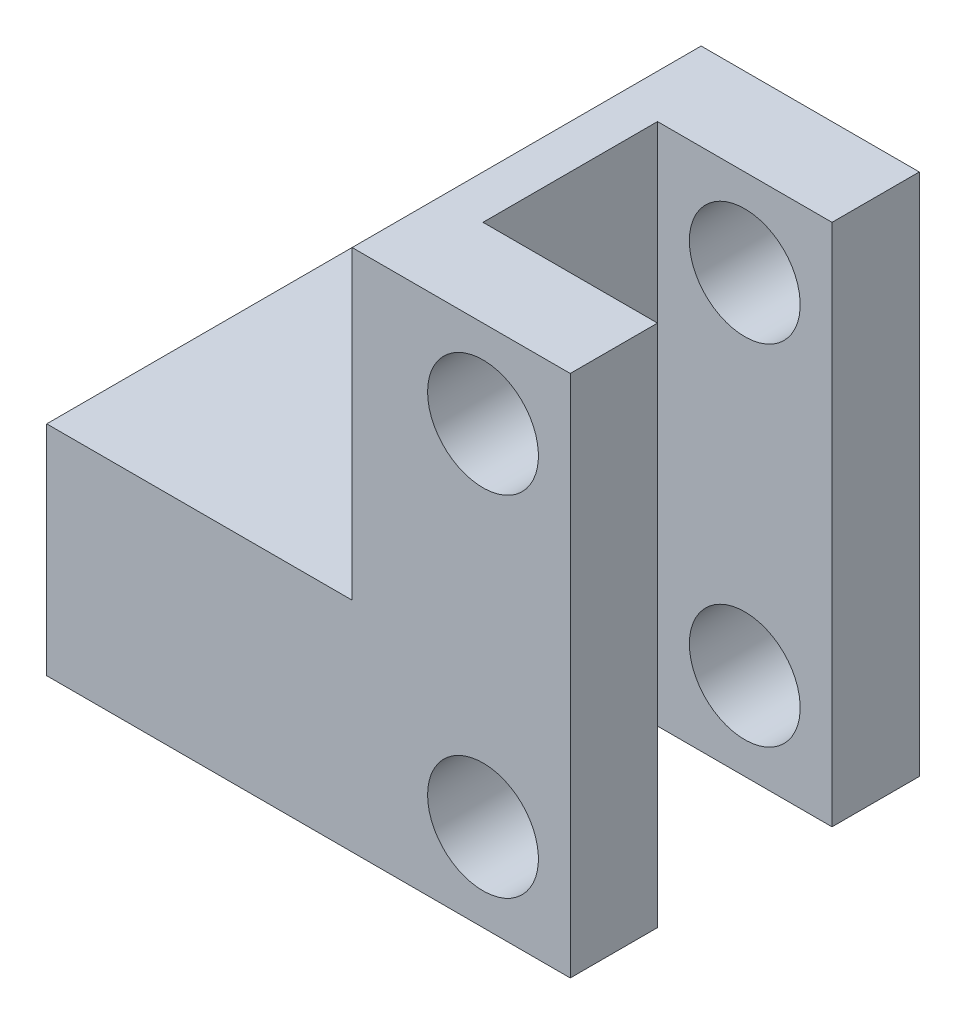
ISO-10303-21;
HEADER;
FILE_DESCRIPTION(('STEP AP214'),'2;1');
FILE_NAME('part.step','',(''),(''),'','','');
FILE_SCHEMA(('AUTOMOTIVE_DESIGN { 1 0 10303 214 1 1 1 1 }'));
ENDSEC;
DATA;
#1=APPLICATION_CONTEXT('core data for automotive mechanical design processes');
#2=APPLICATION_PROTOCOL_DEFINITION('international standard','automotive_design',2000,#1);
#3=PRODUCT_CONTEXT('',#1,'mechanical');
#4=PRODUCT('Part','Part','',(#3));
#5=PRODUCT_RELATED_PRODUCT_CATEGORY('part','',(#4));
#6=PRODUCT_DEFINITION_FORMATION('','',#4);
#7=PRODUCT_DEFINITION_CONTEXT('part definition',#1,'design');
#8=PRODUCT_DEFINITION('design','',#6,#7);
#9=PRODUCT_DEFINITION_SHAPE('','',#8);
#10=(LENGTH_UNIT() NAMED_UNIT(*) SI_UNIT(.MILLI.,.METRE.));
#11=(NAMED_UNIT(*) PLANE_ANGLE_UNIT() SI_UNIT($,.RADIAN.));
#12=(NAMED_UNIT(*) SI_UNIT($,.STERADIAN.) SOLID_ANGLE_UNIT());
#13=UNCERTAINTY_MEASURE_WITH_UNIT(LENGTH_MEASURE(1.E-05),#10,'distance_accuracy_value','');
#14=(GEOMETRIC_REPRESENTATION_CONTEXT(3) GLOBAL_UNCERTAINTY_ASSIGNED_CONTEXT((#13)) GLOBAL_UNIT_ASSIGNED_CONTEXT((#10,
#11,#12)) REPRESENTATION_CONTEXT('',''));
#15=CARTESIAN_POINT('',(0.,0.,0.));
#16=DIRECTION('',(0.,0.,1.));
#17=DIRECTION('',(1.,0.,0.));
#18=AXIS2_PLACEMENT_3D('',#15,#16,#17);
#19=CARTESIAN_POINT('',(30.,-30.,10.));
#20=DIRECTION('',(-1.,0.,0.));
#21=DIRECTION('',(0.,0.,1.));
#22=AXIS2_PLACEMENT_3D('',#19,#20,#21);
#23=PLANE('',#22);
#24=DIRECTION('',(0.,1.,0.));
#25=VECTOR('',#24,1.);
#26=CARTESIAN_POINT('',(30.,-30.,0.));
#27=LINE('',#26,#25);
#28=CARTESIAN_POINT('',(30.,-30.,0.));
#29=VERTEX_POINT('',#28);
#30=CARTESIAN_POINT('',(30.,30.,0.));
#31=VERTEX_POINT('',#30);
#32=EDGE_CURVE('E159',#29,#31,#27,.T.);
#33=ORIENTED_EDGE('',*,*,#32,.T.);
#34=DIRECTION('',(0.,0.,-1.));
#35=VECTOR('',#34,1.);
#36=CARTESIAN_POINT('',(30.,30.,10.));
#37=LINE('',#36,#35);
#38=CARTESIAN_POINT('',(30.,30.,10.));
#39=VERTEX_POINT('',#38);
#40=EDGE_CURVE('E40',#39,#31,#37,.T.);
#41=ORIENTED_EDGE('',*,*,#40,.F.);
#42=DIRECTION('',(0.,1.,0.));
#43=VECTOR('',#42,1.);
#44=CARTESIAN_POINT('',(30.,-30.,10.));
#45=LINE('',#44,#43);
#46=CARTESIAN_POINT('',(30.,-30.,10.));
#47=VERTEX_POINT('',#46);
#48=EDGE_CURVE('E160',#47,#39,#45,.T.);
#49=ORIENTED_EDGE('',*,*,#48,.F.);
#50=DIRECTION('',(0.,0.,-1.));
#51=VECTOR('',#50,1.);
#52=CARTESIAN_POINT('',(30.,-30.,10.));
#53=LINE('',#52,#51);
#54=EDGE_CURVE('E170',#47,#29,#53,.T.);
#55=ORIENTED_EDGE('',*,*,#54,.T.);
#56=EDGE_LOOP('',(#33,#41,#49,#55));
#57=FACE_BOUND('',#56,.T.);
#58=ADVANCED_FACE('F33',(#57),#23,.F.);
#59=CARTESIAN_POINT('',(-30.,30.,10.));
#60=DIRECTION('',(0.,-1.,0.));
#61=DIRECTION('',(0.,0.,-1.));
#62=AXIS2_PLACEMENT_3D('',#59,#60,#61);
#63=PLANE('',#62);
#64=DIRECTION('',(-1.,0.,0.));
#65=VECTOR('',#64,1.);
#66=CARTESIAN_POINT('',(-30.,30.,0.));
#67=LINE('',#66,#65);
#68=CARTESIAN_POINT('',(10.,30.,0.));
#69=VERTEX_POINT('',#68);
#70=EDGE_CURVE('E173',#31,#69,#67,.T.);
#71=ORIENTED_EDGE('',*,*,#70,.T.);
#72=DIRECTION('',(0.,0.,-1.));
#73=VECTOR('',#72,1.);
#74=CARTESIAN_POINT('',(10.,30.,9.99999999999997));
#75=LINE('',#74,#73);
#76=CARTESIAN_POINT('',(10.,30.,-20.));
#77=VERTEX_POINT('',#76);
#78=EDGE_CURVE('E149',#69,#77,#75,.T.);
#79=ORIENTED_EDGE('',*,*,#78,.T.);
#80=DIRECTION('',(1.,0.,0.));
#81=VECTOR('',#80,1.);
#82=CARTESIAN_POINT('',(30.,30.,-20.));
#83=LINE('',#82,#81);
#84=CARTESIAN_POINT('',(30.,30.,-20.));
#85=VERTEX_POINT('',#84);
#86=EDGE_CURVE('E132',#77,#85,#83,.T.);
#87=ORIENTED_EDGE('',*,*,#86,.T.);
#88=DIRECTION('',(0.,0.,1.));
#89=VECTOR('',#88,1.);
#90=CARTESIAN_POINT('',(30.,30.,-30.));
#91=LINE('',#90,#89);
#92=CARTESIAN_POINT('',(30.,30.,-30.));
#93=VERTEX_POINT('',#92);
#94=EDGE_CURVE('E138',#93,#85,#91,.T.);
#95=ORIENTED_EDGE('',*,*,#94,.F.);
#96=DIRECTION('',(1.,0.,0.));
#97=VECTOR('',#96,1.);
#98=CARTESIAN_POINT('',(30.,30.,-30.));
#99=LINE('',#98,#97);
#100=CARTESIAN_POINT('',(5.,30.,-30.));
#101=VERTEX_POINT('',#100);
#102=EDGE_CURVE('E128',#101,#93,#99,.T.);
#103=ORIENTED_EDGE('',*,*,#102,.F.);
#104=DIRECTION('',(0.,0.,-1.));
#105=VECTOR('',#104,1.);
#106=CARTESIAN_POINT('',(5.,30.,9.99999999999997));
#107=LINE('',#106,#105);
#108=CARTESIAN_POINT('',(5.,30.,9.99999999999997));
#109=VERTEX_POINT('',#108);
#110=EDGE_CURVE('E151',#109,#101,#107,.T.);
#111=ORIENTED_EDGE('',*,*,#110,.F.);
#112=DIRECTION('',(-1.,0.,0.));
#113=VECTOR('',#112,1.);
#114=CARTESIAN_POINT('',(-30.,30.,10.));
#115=LINE('',#114,#113);
#116=EDGE_CURVE('E163',#39,#109,#115,.T.);
#117=ORIENTED_EDGE('',*,*,#116,.F.);
#118=ORIENTED_EDGE('',*,*,#40,.T.);
#119=EDGE_LOOP('',(#71,#79,#87,#95,#103,#111,#117,#118));
#120=FACE_BOUND('',#119,.T.);
#121=ADVANCED_FACE('F182',(#120),#63,.F.);
#122=CARTESIAN_POINT('',(-30.,-30.,10.));
#123=DIRECTION('',(1.,0.,0.));
#124=DIRECTION('',(0.,0.,-1.));
#125=AXIS2_PLACEMENT_3D('',#122,#123,#124);
#126=PLANE('',#125);
#127=DIRECTION('',(0.,-1.,0.));
#128=VECTOR('',#127,1.);
#129=CARTESIAN_POINT('',(-30.,-30.,10.));
#130=LINE('',#129,#128);
#131=CARTESIAN_POINT('',(-30.,-5.,10.));
#132=VERTEX_POINT('',#131);
#133=CARTESIAN_POINT('',(-30.,-30.,10.));
#134=VERTEX_POINT('',#133);
#135=EDGE_CURVE('E166',#132,#134,#130,.T.);
#136=ORIENTED_EDGE('',*,*,#135,.F.);
#137=DIRECTION('',(0.,0.,1.));
#138=VECTOR('',#137,1.);
#139=CARTESIAN_POINT('',(-30.,-5.,-30.));
#140=LINE('',#139,#138);
#141=CARTESIAN_POINT('',(-30.,-5.00000000000001,-30.));
#142=VERTEX_POINT('',#141);
#143=EDGE_CURVE('E157',#142,#132,#140,.T.);
#144=ORIENTED_EDGE('',*,*,#143,.F.);
#145=DIRECTION('',(0.,1.,0.));
#146=VECTOR('',#145,1.);
#147=CARTESIAN_POINT('',(-30.,-5.00000000000001,-30.));
#148=LINE('',#147,#146);
#149=CARTESIAN_POINT('',(-30.,-30.,-30.));
#150=VERTEX_POINT('',#149);
#151=EDGE_CURVE('E121',#150,#142,#148,.T.);
#152=ORIENTED_EDGE('',*,*,#151,.F.);
#153=DIRECTION('',(0.,0.,-1.));
#154=VECTOR('',#153,1.);
#155=CARTESIAN_POINT('',(-30.,-30.,10.));
#156=LINE('',#155,#154);
#157=EDGE_CURVE('E117',#134,#150,#156,.T.);
#158=ORIENTED_EDGE('',*,*,#157,.F.);
#159=EDGE_LOOP('',(#136,#144,#152,#158));
#160=FACE_BOUND('',#159,.T.);
#161=ADVANCED_FACE('F262',(#160),#126,.F.);
#162=CARTESIAN_POINT('',(-30.,-30.,10.));
#163=DIRECTION('',(0.,1.,0.));
#164=DIRECTION('',(0.,0.,1.));
#165=AXIS2_PLACEMENT_3D('',#162,#163,#164);
#166=PLANE('',#165);
#167=ORIENTED_EDGE('',*,*,#54,.F.);
#168=DIRECTION('',(1.,0.,0.));
#169=VECTOR('',#168,1.);
#170=CARTESIAN_POINT('',(-30.,-30.,10.));
#171=LINE('',#170,#169);
#172=EDGE_CURVE('E168',#134,#47,#171,.T.);
#173=ORIENTED_EDGE('',*,*,#172,.F.);
#174=ORIENTED_EDGE('',*,*,#157,.T.);
#175=DIRECTION('',(-1.,0.,0.));
#176=VECTOR('',#175,1.);
#177=CARTESIAN_POINT('',(30.,-30.,-30.));
#178=LINE('',#177,#176);
#179=CARTESIAN_POINT('',(30.,-30.,-30.));
#180=VERTEX_POINT('',#179);
#181=EDGE_CURVE('E107',#180,#150,#178,.T.);
#182=ORIENTED_EDGE('',*,*,#181,.F.);
#183=DIRECTION('',(0.,0.,1.));
#184=VECTOR('',#183,1.);
#185=CARTESIAN_POINT('',(30.,-30.,-30.));
#186=LINE('',#185,#184);
#187=CARTESIAN_POINT('',(30.,-30.,-20.));
#188=VERTEX_POINT('',#187);
#189=EDGE_CURVE('E113',#180,#188,#186,.T.);
#190=ORIENTED_EDGE('',*,*,#189,.T.);
#191=DIRECTION('',(-1.,0.,0.));
#192=VECTOR('',#191,1.);
#193=CARTESIAN_POINT('',(30.,-30.,-20.));
#194=LINE('',#193,#192);
#195=CARTESIAN_POINT('',(10.,-30.,-20.));
#196=VERTEX_POINT('',#195);
#197=EDGE_CURVE('E190',#188,#196,#194,.T.);
#198=ORIENTED_EDGE('',*,*,#197,.T.);
#199=DIRECTION('',(0.,0.,-1.));
#200=VECTOR('',#199,1.);
#201=CARTESIAN_POINT('',(10.,-30.,9.99999999999997));
#202=LINE('',#201,#200);
#203=CARTESIAN_POINT('',(10.,-30.,0.));
#204=VERTEX_POINT('',#203);
#205=EDGE_CURVE('E148',#204,#196,#202,.T.);
#206=ORIENTED_EDGE('',*,*,#205,.F.);
#207=DIRECTION('',(1.,0.,0.));
#208=VECTOR('',#207,1.);
#209=CARTESIAN_POINT('',(-30.,-30.,0.));
#210=LINE('',#209,#208);
#211=EDGE_CURVE('E164',#204,#29,#210,.T.);
#212=ORIENTED_EDGE('',*,*,#211,.T.);
#213=EDGE_LOOP('',(#167,#173,#174,#182,#190,#198,#206,#212));
#214=FACE_BOUND('',#213,.T.);
#215=ADVANCED_FACE('F110',(#214),#166,.F.);
#216=CARTESIAN_POINT('',(0.,0.,10.));
#217=DIRECTION('',(0.,0.,-1.));
#218=DIRECTION('',(-1.,0.,0.));
#219=AXIS2_PLACEMENT_3D('',#216,#217,#218);
#220=PLANE('',#219);
#221=CARTESIAN_POINT('',(20.,-20.,10.));
#222=DIRECTION('',(0.,0.,-1.));
#223=DIRECTION('',(-1.,0.,0.));
#224=AXIS2_PLACEMENT_3D('',#221,#222,#223);
#225=CIRCLE('',#224,6.35);
#226=CARTESIAN_POINT('',(13.65,-20.,10.));
#227=VERTEX_POINT('',#226);
#228=EDGE_CURVE('E199',#227,#227,#225,.F.);
#229=ORIENTED_EDGE('',*,*,#228,.F.);
#230=EDGE_LOOP('',(#229));
#231=FACE_BOUND('',#230,.T.);
#232=CARTESIAN_POINT('',(20.,20.,10.));
#233=DIRECTION('',(0.,0.,-1.));
#234=DIRECTION('',(-1.,0.,0.));
#235=AXIS2_PLACEMENT_3D('',#232,#233,#234);
#236=CIRCLE('',#235,6.35);
#237=CARTESIAN_POINT('',(13.65,20.,10.));
#238=VERTEX_POINT('',#237);
#239=EDGE_CURVE('E215',#238,#238,#236,.F.);
#240=ORIENTED_EDGE('',*,*,#239,.F.);
#241=EDGE_LOOP('',(#240));
#242=FACE_BOUND('',#241,.T.);
#243=ORIENTED_EDGE('',*,*,#172,.T.);
#244=ORIENTED_EDGE('',*,*,#48,.T.);
#245=ORIENTED_EDGE('',*,*,#116,.T.);
#246=DIRECTION('',(0.,1.,0.));
#247=VECTOR('',#246,1.);
#248=CARTESIAN_POINT('',(5.,-5.00000000000001,9.99999999999997));
#249=LINE('',#248,#247);
#250=CARTESIAN_POINT('',(5.,-5.,10.));
#251=VERTEX_POINT('',#250);
#252=EDGE_CURVE('E141',#251,#109,#249,.T.);
#253=ORIENTED_EDGE('',*,*,#252,.F.);
#254=DIRECTION('',(1.,0.,0.));
#255=VECTOR('',#254,1.);
#256=CARTESIAN_POINT('',(10.,-5.,10.));
#257=LINE('',#256,#255);
#258=EDGE_CURVE('E53',#132,#251,#257,.T.);
#259=ORIENTED_EDGE('',*,*,#258,.F.);
#260=ORIENTED_EDGE('',*,*,#135,.T.);
#261=EDGE_LOOP('',(#243,#244,#245,#253,#259,#260));
#262=FACE_BOUND('',#261,.T.);
#263=ADVANCED_FACE('F271',(#231,#242,#262),#220,.F.);
#264=CARTESIAN_POINT('',(0.,0.,0.));
#265=DIRECTION('',(0.,0.,-1.));
#266=DIRECTION('',(-1.,0.,0.));
#267=AXIS2_PLACEMENT_3D('',#264,#265,#266);
#268=PLANE('',#267);
#269=CARTESIAN_POINT('',(20.,-20.,0.));
#270=DIRECTION('',(0.,0.,-1.));
#271=DIRECTION('',(-1.,0.,0.));
#272=AXIS2_PLACEMENT_3D('',#269,#270,#271);
#273=CIRCLE('',#272,6.35);
#274=CARTESIAN_POINT('',(13.65,-20.,0.));
#275=VERTEX_POINT('',#274);
#276=EDGE_CURVE('E209',#275,#275,#273,.F.);
#277=ORIENTED_EDGE('',*,*,#276,.T.);
#278=EDGE_LOOP('',(#277));
#279=FACE_BOUND('',#278,.T.);
#280=CARTESIAN_POINT('',(20.,20.,0.));
#281=DIRECTION('',(0.,0.,-1.));
#282=DIRECTION('',(-1.,0.,0.));
#283=AXIS2_PLACEMENT_3D('',#280,#281,#282);
#284=CIRCLE('',#283,6.35);
#285=CARTESIAN_POINT('',(13.65,20.,0.));
#286=VERTEX_POINT('',#285);
#287=EDGE_CURVE('E218',#286,#286,#284,.F.);
#288=ORIENTED_EDGE('',*,*,#287,.T.);
#289=EDGE_LOOP('',(#288));
#290=FACE_BOUND('',#289,.T.);
#291=ORIENTED_EDGE('',*,*,#211,.F.);
#292=DIRECTION('',(0.,-1.,0.));
#293=VECTOR('',#292,1.);
#294=CARTESIAN_POINT('',(10.,0.,0.));
#295=LINE('',#294,#293);
#296=EDGE_CURVE('E11',#69,#204,#295,.T.);
#297=ORIENTED_EDGE('',*,*,#296,.F.);
#298=ORIENTED_EDGE('',*,*,#70,.F.);
#299=ORIENTED_EDGE('',*,*,#32,.F.);
#300=EDGE_LOOP('',(#291,#297,#298,#299));
#301=FACE_BOUND('',#300,.T.);
#302=ADVANCED_FACE('F188',(#279,#290,#301),#268,.T.);
#303=CARTESIAN_POINT('',(10.,-5.,-30.));
#304=DIRECTION('',(0.,-1.,0.));
#305=DIRECTION('',(1.,0.,0.));
#306=AXIS2_PLACEMENT_3D('',#303,#304,#305);
#307=PLANE('',#306);
#308=ORIENTED_EDGE('',*,*,#258,.T.);
#309=DIRECTION('',(0.,0.,-1.));
#310=VECTOR('',#309,1.);
#311=CARTESIAN_POINT('',(5.,-5.00000000000001,9.99999999999997));
#312=LINE('',#311,#310);
#313=CARTESIAN_POINT('',(5.,-5.00000000000001,-30.));
#314=VERTEX_POINT('',#313);
#315=EDGE_CURVE('E153',#251,#314,#312,.T.);
#316=ORIENTED_EDGE('',*,*,#315,.T.);
#317=DIRECTION('',(1.,0.,0.));
#318=VECTOR('',#317,1.);
#319=CARTESIAN_POINT('',(5.,-5.00000000000001,-30.));
#320=LINE('',#319,#318);
#321=EDGE_CURVE('E203',#142,#314,#320,.T.);
#322=ORIENTED_EDGE('',*,*,#321,.F.);
#323=ORIENTED_EDGE('',*,*,#143,.T.);
#324=EDGE_LOOP('',(#308,#316,#322,#323));
#325=FACE_BOUND('',#324,.T.);
#326=ADVANCED_FACE('F274',(#325),#307,.F.);
#327=CARTESIAN_POINT('',(10.,30.,9.99999999999997));
#328=DIRECTION('',(1.,0.,0.));
#329=DIRECTION('',(0.,0.,-1.));
#330=AXIS2_PLACEMENT_3D('',#327,#328,#329);
#331=PLANE('',#330);
#332=ORIENTED_EDGE('',*,*,#78,.F.);
#333=ORIENTED_EDGE('',*,*,#296,.T.);
#334=ORIENTED_EDGE('',*,*,#205,.T.);
#335=DIRECTION('',(0.,-1.,0.));
#336=VECTOR('',#335,1.);
#337=CARTESIAN_POINT('',(10.,30.,-20.));
#338=LINE('',#337,#336);
#339=EDGE_CURVE('E137',#77,#196,#338,.T.);
#340=ORIENTED_EDGE('',*,*,#339,.F.);
#341=EDGE_LOOP('',(#332,#333,#334,#340));
#342=FACE_BOUND('',#341,.T.);
#343=ADVANCED_FACE('F192',(#342),#331,.T.);
#344=CARTESIAN_POINT('',(5.,-5.00000000000001,9.99999999999997));
#345=DIRECTION('',(-1.,0.,0.));
#346=DIRECTION('',(0.,-1.,0.));
#347=AXIS2_PLACEMENT_3D('',#344,#345,#346);
#348=PLANE('',#347);
#349=ORIENTED_EDGE('',*,*,#110,.T.);
#350=DIRECTION('',(0.,1.,0.));
#351=VECTOR('',#350,1.);
#352=CARTESIAN_POINT('',(5.,-5.00000000000001,-30.));
#353=LINE('',#352,#351);
#354=EDGE_CURVE('E201',#314,#101,#353,.T.);
#355=ORIENTED_EDGE('',*,*,#354,.F.);
#356=ORIENTED_EDGE('',*,*,#315,.F.);
#357=ORIENTED_EDGE('',*,*,#252,.T.);
#358=EDGE_LOOP('',(#349,#355,#356,#357));
#359=FACE_BOUND('',#358,.T.);
#360=ADVANCED_FACE('F244',(#359),#348,.T.);
#361=CARTESIAN_POINT('',(0.,0.,-20.));
#362=DIRECTION('',(0.,0.,-1.));
#363=DIRECTION('',(-1.,0.,0.));
#364=AXIS2_PLACEMENT_3D('',#361,#362,#363);
#365=PLANE('',#364);
#366=CARTESIAN_POINT('',(20.,-20.,-20.));
#367=DIRECTION('',(0.,0.,-1.));
#368=DIRECTION('',(-1.,0.,0.));
#369=AXIS2_PLACEMENT_3D('',#366,#367,#368);
#370=CIRCLE('',#369,6.35);
#371=CARTESIAN_POINT('',(13.65,-20.,-20.));
#372=VERTEX_POINT('',#371);
#373=EDGE_CURVE('E212',#372,#372,#370,.F.);
#374=ORIENTED_EDGE('',*,*,#373,.F.);
#375=EDGE_LOOP('',(#374));
#376=FACE_BOUND('',#375,.T.);
#377=CARTESIAN_POINT('',(20.,20.,-20.));
#378=DIRECTION('',(0.,0.,-1.));
#379=DIRECTION('',(-1.,0.,0.));
#380=AXIS2_PLACEMENT_3D('',#377,#378,#379);
#381=CIRCLE('',#380,6.35);
#382=CARTESIAN_POINT('',(13.65,20.,-20.));
#383=VERTEX_POINT('',#382);
#384=EDGE_CURVE('E221',#383,#383,#381,.F.);
#385=ORIENTED_EDGE('',*,*,#384,.F.);
#386=EDGE_LOOP('',(#385));
#387=FACE_BOUND('',#386,.T.);
#388=ORIENTED_EDGE('',*,*,#86,.F.);
#389=ORIENTED_EDGE('',*,*,#339,.T.);
#390=ORIENTED_EDGE('',*,*,#197,.F.);
#391=DIRECTION('',(0.,-1.,0.));
#392=VECTOR('',#391,1.);
#393=CARTESIAN_POINT('',(30.,30.,-20.));
#394=LINE('',#393,#392);
#395=EDGE_CURVE('E136',#85,#188,#394,.T.);
#396=ORIENTED_EDGE('',*,*,#395,.F.);
#397=EDGE_LOOP('',(#388,#389,#390,#396));
#398=FACE_BOUND('',#397,.T.);
#399=ADVANCED_FACE('F195',(#376,#387,#398),#365,.F.);
#400=CARTESIAN_POINT('',(30.,30.,-30.));
#401=DIRECTION('',(-1.,0.,0.));
#402=DIRECTION('',(0.,0.,1.));
#403=AXIS2_PLACEMENT_3D('',#400,#401,#402);
#404=PLANE('',#403);
#405=ORIENTED_EDGE('',*,*,#395,.T.);
#406=ORIENTED_EDGE('',*,*,#189,.F.);
#407=DIRECTION('',(0.,-1.,0.));
#408=VECTOR('',#407,1.);
#409=CARTESIAN_POINT('',(30.,30.,-30.));
#410=LINE('',#409,#408);
#411=EDGE_CURVE('E122',#93,#180,#410,.T.);
#412=ORIENTED_EDGE('',*,*,#411,.F.);
#413=ORIENTED_EDGE('',*,*,#94,.T.);
#414=EDGE_LOOP('',(#405,#406,#412,#413));
#415=FACE_BOUND('',#414,.T.);
#416=ADVANCED_FACE('F134',(#415),#404,.F.);
#417=CARTESIAN_POINT('',(0.,0.,-30.));
#418=DIRECTION('',(0.,0.,-1.));
#419=DIRECTION('',(-1.,0.,0.));
#420=AXIS2_PLACEMENT_3D('',#417,#418,#419);
#421=PLANE('',#420);
#422=CARTESIAN_POINT('',(20.,-20.,-30.));
#423=DIRECTION('',(0.,0.,1.));
#424=DIRECTION('',(1.,0.,0.));
#425=AXIS2_PLACEMENT_3D('',#422,#423,#424);
#426=CIRCLE('',#425,6.35);
#427=CARTESIAN_POINT('',(13.65,-20.,-30.));
#428=VERTEX_POINT('',#427);
#429=EDGE_CURVE('E224',#428,#428,#426,.T.);
#430=ORIENTED_EDGE('',*,*,#429,.T.);
#431=EDGE_LOOP('',(#430));
#432=FACE_BOUND('',#431,.T.);
#433=CARTESIAN_POINT('',(20.,20.,-30.));
#434=DIRECTION('',(0.,0.,1.));
#435=DIRECTION('',(1.,0.,0.));
#436=AXIS2_PLACEMENT_3D('',#433,#434,#435);
#437=CIRCLE('',#436,6.35);
#438=CARTESIAN_POINT('',(13.65,20.,-30.));
#439=VERTEX_POINT('',#438);
#440=EDGE_CURVE('E225',#439,#439,#437,.T.);
#441=ORIENTED_EDGE('',*,*,#440,.T.);
#442=EDGE_LOOP('',(#441));
#443=FACE_BOUND('',#442,.T.);
#444=ORIENTED_EDGE('',*,*,#411,.T.);
#445=ORIENTED_EDGE('',*,*,#181,.T.);
#446=ORIENTED_EDGE('',*,*,#151,.T.);
#447=ORIENTED_EDGE('',*,*,#321,.T.);
#448=ORIENTED_EDGE('',*,*,#354,.T.);
#449=ORIENTED_EDGE('',*,*,#102,.T.);
#450=EDGE_LOOP('',(#444,#445,#446,#447,#448,#449));
#451=FACE_BOUND('',#450,.T.);
#452=ADVANCED_FACE('F125',(#432,#443,#451),#421,.T.);
#453=CARTESIAN_POINT('',(20.,20.,50.));
#454=DIRECTION('',(0.,0.,-1.));
#455=DIRECTION('',(-1.,0.,0.));
#456=AXIS2_PLACEMENT_3D('',#453,#454,#455);
#457=CYLINDRICAL_SURFACE('',#456,6.35);
#458=CARTESIAN_POINT('',(13.65,20.,-30.));
#459=CARTESIAN_POINT('',(13.65,20.,-29.8958333333333));
#460=CARTESIAN_POINT('',(13.65,20.,-29.7916666666667));
#461=CARTESIAN_POINT('',(13.65,20.,-29.5833333333333));
#462=CARTESIAN_POINT('',(13.65,20.,-29.4791666666667));
#463=CARTESIAN_POINT('',(13.65,20.,-29.2708333333333));
#464=CARTESIAN_POINT('',(13.65,20.,-29.1666666666667));
#465=CARTESIAN_POINT('',(13.65,20.,-28.9583333333333));
#466=CARTESIAN_POINT('',(13.65,20.,-28.8541666666667));
#467=CARTESIAN_POINT('',(13.65,20.,-28.6458333333333));
#468=CARTESIAN_POINT('',(13.65,20.,-28.5416666666667));
#469=CARTESIAN_POINT('',(13.65,20.,-28.3333333333333));
#470=CARTESIAN_POINT('',(13.65,20.,-28.2291666666667));
#471=CARTESIAN_POINT('',(13.65,20.,-28.0208333333333));
#472=CARTESIAN_POINT('',(13.65,20.,-27.9166666666667));
#473=CARTESIAN_POINT('',(13.65,20.,-27.7083333333333));
#474=CARTESIAN_POINT('',(13.65,20.,-27.6041666666667));
#475=CARTESIAN_POINT('',(13.65,20.,-27.3958333333333));
#476=CARTESIAN_POINT('',(13.65,20.,-27.2916666666667));
#477=CARTESIAN_POINT('',(13.65,20.,-27.0833333333333));
#478=CARTESIAN_POINT('',(13.65,20.,-26.9791666666667));
#479=CARTESIAN_POINT('',(13.65,20.,-26.7708333333333));
#480=CARTESIAN_POINT('',(13.65,20.,-26.6666666666667));
#481=CARTESIAN_POINT('',(13.65,20.,-26.4583333333333));
#482=CARTESIAN_POINT('',(13.65,20.,-26.3541666666667));
#483=CARTESIAN_POINT('',(13.65,20.,-26.1458333333333));
#484=CARTESIAN_POINT('',(13.65,20.,-26.0416666666667));
#485=CARTESIAN_POINT('',(13.65,20.,-25.8333333333333));
#486=CARTESIAN_POINT('',(13.65,20.,-25.7291666666667));
#487=CARTESIAN_POINT('',(13.65,20.,-25.5208333333333));
#488=CARTESIAN_POINT('',(13.65,20.,-25.4166666666667));
#489=CARTESIAN_POINT('',(13.65,20.,-25.2083333333333));
#490=CARTESIAN_POINT('',(13.65,20.,-25.1041666666667));
#491=CARTESIAN_POINT('',(13.65,20.,-24.8958333333333));
#492=CARTESIAN_POINT('',(13.65,20.,-24.7916666666667));
#493=CARTESIAN_POINT('',(13.65,20.,-24.5833333333333));
#494=CARTESIAN_POINT('',(13.65,20.,-24.4791666666667));
#495=CARTESIAN_POINT('',(13.65,20.,-24.2708333333333));
#496=CARTESIAN_POINT('',(13.65,20.,-24.1666666666667));
#497=CARTESIAN_POINT('',(13.65,20.,-23.9583333333333));
#498=CARTESIAN_POINT('',(13.65,20.,-23.8541666666667));
#499=CARTESIAN_POINT('',(13.65,20.,-23.6458333333333));
#500=CARTESIAN_POINT('',(13.65,20.,-23.5416666666667));
#501=CARTESIAN_POINT('',(13.65,20.,-23.3333333333333));
#502=CARTESIAN_POINT('',(13.65,20.,-23.2291666666667));
#503=CARTESIAN_POINT('',(13.65,20.,-23.0208333333333));
#504=CARTESIAN_POINT('',(13.65,20.,-22.9166666666667));
#505=CARTESIAN_POINT('',(13.65,20.,-22.7083333333333));
#506=CARTESIAN_POINT('',(13.65,20.,-22.6041666666666));
#507=CARTESIAN_POINT('',(13.65,20.,-22.3958333333333));
#508=CARTESIAN_POINT('',(13.65,20.,-22.2916666666667));
#509=CARTESIAN_POINT('',(13.65,20.,-22.0833333333333));
#510=CARTESIAN_POINT('',(13.65,20.,-21.9791666666666));
#511=CARTESIAN_POINT('',(13.65,20.,-21.7708333333333));
#512=CARTESIAN_POINT('',(13.65,20.,-21.6666666666667));
#513=CARTESIAN_POINT('',(13.65,20.,-21.4583333333333));
#514=CARTESIAN_POINT('',(13.65,20.,-21.3541666666666));
#515=CARTESIAN_POINT('',(13.65,20.,-21.1458333333333));
#516=CARTESIAN_POINT('',(13.65,20.,-21.0416666666667));
#517=CARTESIAN_POINT('',(13.65,20.,-20.8333333333333));
#518=CARTESIAN_POINT('',(13.65,20.,-20.7291666666666));
#519=CARTESIAN_POINT('',(13.65,20.,-20.5208333333333));
#520=CARTESIAN_POINT('',(13.65,20.,-20.4166666666666));
#521=CARTESIAN_POINT('',(13.65,20.,-20.2083333333333));
#522=CARTESIAN_POINT('',(13.65,20.,-20.1041666666666));
#523=CARTESIAN_POINT('',(13.65,20.,-20.));
#524=B_SPLINE_CURVE_WITH_KNOTS('',3,(#458,#459,#460,#461,#462,#463,#464,#465,#466,#467,#468,
#469,#470,#471,#472,#473,#474,#475,#476,#477,#478,#479,#480,#481,#482,#483,#484,#485,#486,#487,
#488,#489,#490,#491,#492,#493,#494,#495,#496,#497,#498,#499,#500,#501,#502,#503,#504,#505,#506,
#507,#508,#509,#510,#511,#512,#513,#514,#515,#516,#517,#518,#519,#520,#521,#522,#523),
.UNSPECIFIED.,.F.,.F.,(4,2,2,2,2,2,2,2,2,2,2,2,2,2,2,2,2,2,2,2,2,2,2,2,2,2,2,2,2,2,2,2,4),(0.,
0.312500000000007,0.625000000000001,0.937500000000008,1.25,1.56250000000001,1.875,
2.18750000000001,2.5,2.81250000000001,3.12500000000002,3.43750000000001,3.75000000000002,
4.06250000000001,4.37500000000002,4.68750000000001,5.00000000000002,5.31250000000003,
5.62500000000002,5.93750000000003,6.25000000000002,6.56250000000003,6.87500000000002,
7.18750000000003,7.50000000000003,7.81250000000003,8.12500000000004,8.43750000000003,
8.75000000000004,9.06250000000003,9.37500000000004,9.68750000000004,10.),.UNSPECIFIED.);
#525=EDGE_CURVE('BSEAM237',#439,#383,#524,.T.);
#526=ORIENTED_EDGE('',*,*,#440,.F.);
#527=ORIENTED_EDGE('',*,*,#384,.T.);
#528=ORIENTED_EDGE('',*,*,#525,.T.);
#529=ORIENTED_EDGE('',*,*,#525,.F.);
#530=EDGE_LOOP('',(#526,#528,#527,#529));
#531=FACE_BOUND('',#530,.T.);
#532=ADVANCED_FACE('F237',(#531),#457,.F.);
#533=CARTESIAN_POINT('',(20.,-20.,50.));
#534=DIRECTION('',(0.,0.,-1.));
#535=DIRECTION('',(-1.,0.,0.));
#536=AXIS2_PLACEMENT_3D('',#533,#534,#535);
#537=CYLINDRICAL_SURFACE('',#536,6.35);
#538=CARTESIAN_POINT('',(13.65,-20.,-30.));
#539=CARTESIAN_POINT('',(13.65,-20.,-29.8958333333333));
#540=CARTESIAN_POINT('',(13.65,-20.,-29.7916666666667));
#541=CARTESIAN_POINT('',(13.65,-20.,-29.5833333333333));
#542=CARTESIAN_POINT('',(13.65,-20.,-29.4791666666667));
#543=CARTESIAN_POINT('',(13.65,-20.,-29.2708333333333));
#544=CARTESIAN_POINT('',(13.65,-20.,-29.1666666666667));
#545=CARTESIAN_POINT('',(13.65,-20.,-28.9583333333333));
#546=CARTESIAN_POINT('',(13.65,-20.,-28.8541666666667));
#547=CARTESIAN_POINT('',(13.65,-20.,-28.6458333333333));
#548=CARTESIAN_POINT('',(13.65,-20.,-28.5416666666667));
#549=CARTESIAN_POINT('',(13.65,-20.,-28.3333333333333));
#550=CARTESIAN_POINT('',(13.65,-20.,-28.2291666666667));
#551=CARTESIAN_POINT('',(13.65,-20.,-28.0208333333333));
#552=CARTESIAN_POINT('',(13.65,-20.,-27.9166666666667));
#553=CARTESIAN_POINT('',(13.65,-20.,-27.7083333333333));
#554=CARTESIAN_POINT('',(13.65,-20.,-27.6041666666667));
#555=CARTESIAN_POINT('',(13.65,-20.,-27.3958333333333));
#556=CARTESIAN_POINT('',(13.65,-20.,-27.2916666666667));
#557=CARTESIAN_POINT('',(13.65,-20.,-27.0833333333333));
#558=CARTESIAN_POINT('',(13.65,-20.,-26.9791666666667));
#559=CARTESIAN_POINT('',(13.65,-20.,-26.7708333333333));
#560=CARTESIAN_POINT('',(13.65,-20.,-26.6666666666667));
#561=CARTESIAN_POINT('',(13.65,-20.,-26.4583333333333));
#562=CARTESIAN_POINT('',(13.65,-20.,-26.3541666666667));
#563=CARTESIAN_POINT('',(13.65,-20.,-26.1458333333333));
#564=CARTESIAN_POINT('',(13.65,-20.,-26.0416666666667));
#565=CARTESIAN_POINT('',(13.65,-20.,-25.8333333333333));
#566=CARTESIAN_POINT('',(13.65,-20.,-25.7291666666667));
#567=CARTESIAN_POINT('',(13.65,-20.,-25.5208333333333));
#568=CARTESIAN_POINT('',(13.65,-20.,-25.4166666666667));
#569=CARTESIAN_POINT('',(13.65,-20.,-25.2083333333333));
#570=CARTESIAN_POINT('',(13.65,-20.,-25.1041666666667));
#571=CARTESIAN_POINT('',(13.65,-20.,-24.8958333333333));
#572=CARTESIAN_POINT('',(13.65,-20.,-24.7916666666667));
#573=CARTESIAN_POINT('',(13.65,-20.,-24.5833333333333));
#574=CARTESIAN_POINT('',(13.65,-20.,-24.4791666666667));
#575=CARTESIAN_POINT('',(13.65,-20.,-24.2708333333333));
#576=CARTESIAN_POINT('',(13.65,-20.,-24.1666666666667));
#577=CARTESIAN_POINT('',(13.65,-20.,-23.9583333333333));
#578=CARTESIAN_POINT('',(13.65,-20.,-23.8541666666667));
#579=CARTESIAN_POINT('',(13.65,-20.,-23.6458333333333));
#580=CARTESIAN_POINT('',(13.65,-20.,-23.5416666666667));
#581=CARTESIAN_POINT('',(13.65,-20.,-23.3333333333333));
#582=CARTESIAN_POINT('',(13.65,-20.,-23.2291666666667));
#583=CARTESIAN_POINT('',(13.65,-20.,-23.0208333333333));
#584=CARTESIAN_POINT('',(13.65,-20.,-22.9166666666667));
#585=CARTESIAN_POINT('',(13.65,-20.,-22.7083333333333));
#586=CARTESIAN_POINT('',(13.65,-20.,-22.6041666666666));
#587=CARTESIAN_POINT('',(13.65,-20.,-22.3958333333333));
#588=CARTESIAN_POINT('',(13.65,-20.,-22.2916666666667));
#589=CARTESIAN_POINT('',(13.65,-20.,-22.0833333333333));
#590=CARTESIAN_POINT('',(13.65,-20.,-21.9791666666666));
#591=CARTESIAN_POINT('',(13.65,-20.,-21.7708333333333));
#592=CARTESIAN_POINT('',(13.65,-20.,-21.6666666666667));
#593=CARTESIAN_POINT('',(13.65,-20.,-21.4583333333333));
#594=CARTESIAN_POINT('',(13.65,-20.,-21.3541666666666));
#595=CARTESIAN_POINT('',(13.65,-20.,-21.1458333333333));
#596=CARTESIAN_POINT('',(13.65,-20.,-21.0416666666667));
#597=CARTESIAN_POINT('',(13.65,-20.,-20.8333333333333));
#598=CARTESIAN_POINT('',(13.65,-20.,-20.7291666666666));
#599=CARTESIAN_POINT('',(13.65,-20.,-20.5208333333333));
#600=CARTESIAN_POINT('',(13.65,-20.,-20.4166666666666));
#601=CARTESIAN_POINT('',(13.65,-20.,-20.2083333333333));
#602=CARTESIAN_POINT('',(13.65,-20.,-20.1041666666666));
#603=CARTESIAN_POINT('',(13.65,-20.,-20.));
#604=B_SPLINE_CURVE_WITH_KNOTS('',3,(#538,#539,#540,#541,#542,#543,#544,#545,#546,#547,#548,
#549,#550,#551,#552,#553,#554,#555,#556,#557,#558,#559,#560,#561,#562,#563,#564,#565,#566,#567,
#568,#569,#570,#571,#572,#573,#574,#575,#576,#577,#578,#579,#580,#581,#582,#583,#584,#585,#586,
#587,#588,#589,#590,#591,#592,#593,#594,#595,#596,#597,#598,#599,#600,#601,#602,#603),
.UNSPECIFIED.,.F.,.F.,(4,2,2,2,2,2,2,2,2,2,2,2,2,2,2,2,2,2,2,2,2,2,2,2,2,2,2,2,2,2,2,2,4),(0.,
0.312500000000007,0.625000000000001,0.937500000000008,1.25,1.56250000000001,1.875,
2.18750000000001,2.5,2.81250000000001,3.12500000000002,3.43750000000001,3.75000000000002,
4.06250000000001,4.37500000000002,4.68750000000001,5.00000000000002,5.31250000000003,
5.62500000000002,5.93750000000003,6.25000000000002,6.56250000000003,6.87500000000002,
7.18750000000003,7.50000000000003,7.81250000000003,8.12500000000004,8.43750000000003,
8.75000000000004,9.06250000000003,9.37500000000004,9.68750000000004,10.),.UNSPECIFIED.);
#605=EDGE_CURVE('BSEAM233',#428,#372,#604,.T.);
#606=ORIENTED_EDGE('',*,*,#429,.F.);
#607=ORIENTED_EDGE('',*,*,#373,.T.);
#608=ORIENTED_EDGE('',*,*,#605,.T.);
#609=ORIENTED_EDGE('',*,*,#605,.F.);
#610=EDGE_LOOP('',(#606,#608,#607,#609));
#611=FACE_BOUND('',#610,.T.);
#612=ADVANCED_FACE('F233',(#611),#537,.F.);
#613=CARTESIAN_POINT('',(13.65,20.,0.));
#614=CARTESIAN_POINT('',(13.65,20.,0.104166666666674));
#615=CARTESIAN_POINT('',(13.65,20.,0.20833333333334));
#616=CARTESIAN_POINT('',(13.65,20.,0.416666666666674));
#617=CARTESIAN_POINT('',(13.65,20.,0.520833333333341));
#618=CARTESIAN_POINT('',(13.65,20.,0.729166666666674));
#619=CARTESIAN_POINT('',(13.65,20.,0.833333333333341));
#620=CARTESIAN_POINT('',(13.65,20.,1.04166666666667));
#621=CARTESIAN_POINT('',(13.65,20.,1.14583333333334));
#622=CARTESIAN_POINT('',(13.65,20.,1.35416666666667));
#623=CARTESIAN_POINT('',(13.65,20.,1.45833333333334));
#624=CARTESIAN_POINT('',(13.65,20.,1.66666666666667));
#625=CARTESIAN_POINT('',(13.65,20.,1.77083333333334));
#626=CARTESIAN_POINT('',(13.65,20.,1.97916666666668));
#627=CARTESIAN_POINT('',(13.65,20.,2.08333333333334));
#628=CARTESIAN_POINT('',(13.65,20.,2.29166666666668));
#629=CARTESIAN_POINT('',(13.65,20.,2.39583333333334));
#630=CARTESIAN_POINT('',(13.65,20.,2.60416666666667));
#631=CARTESIAN_POINT('',(13.65,20.,2.70833333333334));
#632=CARTESIAN_POINT('',(13.65,20.,2.91666666666667));
#633=CARTESIAN_POINT('',(13.65,20.,3.02083333333334));
#634=CARTESIAN_POINT('',(13.65,20.,3.22916666666667));
#635=CARTESIAN_POINT('',(13.65,20.,3.33333333333334));
#636=CARTESIAN_POINT('',(13.65,20.,3.54166666666667));
#637=CARTESIAN_POINT('',(13.65,20.,3.64583333333334));
#638=CARTESIAN_POINT('',(13.65,20.,3.85416666666667));
#639=CARTESIAN_POINT('',(13.65,20.,3.95833333333334));
#640=CARTESIAN_POINT('',(13.65,20.,4.16666666666667));
#641=CARTESIAN_POINT('',(13.65,20.,4.27083333333334));
#642=CARTESIAN_POINT('',(13.65,20.,4.47916666666667));
#643=CARTESIAN_POINT('',(13.65,20.,4.58333333333334));
#644=CARTESIAN_POINT('',(13.65,20.,4.79166666666667));
#645=CARTESIAN_POINT('',(13.65,20.,4.89583333333334));
#646=CARTESIAN_POINT('',(13.65,20.,5.10416666666667));
#647=CARTESIAN_POINT('',(13.65,20.,5.20833333333334));
#648=CARTESIAN_POINT('',(13.65,20.,5.41666666666667));
#649=CARTESIAN_POINT('',(13.65,20.,5.52083333333334));
#650=CARTESIAN_POINT('',(13.65,20.,5.72916666666667));
#651=CARTESIAN_POINT('',(13.65,20.,5.83333333333334));
#652=CARTESIAN_POINT('',(13.65,20.,6.04166666666667));
#653=CARTESIAN_POINT('',(13.65,20.,6.14583333333334));
#654=CARTESIAN_POINT('',(13.65,20.,6.35416666666667));
#655=CARTESIAN_POINT('',(13.65,20.,6.45833333333334));
#656=CARTESIAN_POINT('',(13.65,20.,6.66666666666667));
#657=CARTESIAN_POINT('',(13.65,20.,6.77083333333334));
#658=CARTESIAN_POINT('',(13.65,20.,6.97916666666667));
#659=CARTESIAN_POINT('',(13.65,20.,7.08333333333334));
#660=CARTESIAN_POINT('',(13.65,20.,7.29166666666667));
#661=CARTESIAN_POINT('',(13.65,20.,7.39583333333333));
#662=CARTESIAN_POINT('',(13.65,20.,7.60416666666667));
#663=CARTESIAN_POINT('',(13.65,20.,7.70833333333334));
#664=CARTESIAN_POINT('',(13.65,20.,7.91666666666667));
#665=CARTESIAN_POINT('',(13.65,20.,8.02083333333334));
#666=CARTESIAN_POINT('',(13.65,20.,8.22916666666667));
#667=CARTESIAN_POINT('',(13.65,20.,8.33333333333333));
#668=CARTESIAN_POINT('',(13.65,20.,8.54166666666667));
#669=CARTESIAN_POINT('',(13.65,20.,8.64583333333333));
#670=CARTESIAN_POINT('',(13.65,20.,8.85416666666667));
#671=CARTESIAN_POINT('',(13.65,20.,8.95833333333333));
#672=CARTESIAN_POINT('',(13.65,20.,9.16666666666667));
#673=CARTESIAN_POINT('',(13.65,20.,9.27083333333333));
#674=CARTESIAN_POINT('',(13.65,20.,9.47916666666667));
#675=CARTESIAN_POINT('',(13.65,20.,9.58333333333333));
#676=CARTESIAN_POINT('',(13.65,20.,9.79166666666667));
#677=CARTESIAN_POINT('',(13.65,20.,9.89583333333333));
#678=CARTESIAN_POINT('',(13.65,20.,10.));
#679=B_SPLINE_CURVE_WITH_KNOTS('',3,(#613,#614,#615,#616,#617,#618,#619,#620,#621,#622,#623,
#624,#625,#626,#627,#628,#629,#630,#631,#632,#633,#634,#635,#636,#637,#638,#639,#640,#641,#642,
#643,#644,#645,#646,#647,#648,#649,#650,#651,#652,#653,#654,#655,#656,#657,#658,#659,#660,#661,
#662,#663,#664,#665,#666,#667,#668,#669,#670,#671,#672,#673,#674,#675,#676,#677,#678),
.UNSPECIFIED.,.F.,.F.,(4,2,2,2,2,2,2,2,2,2,2,2,2,2,2,2,2,2,2,2,2,2,2,2,2,2,2,2,2,2,2,2,4),(0.,
0.3125,0.625000000000001,0.937500000000001,1.25,1.5625,1.875,2.1875,2.5,2.8125,3.125,3.4375,
3.75,4.0625,4.375,4.6875,5.,5.3125,5.625,5.9375,6.25,6.5625,6.875,7.1875,7.49999999999999,
7.8125,8.12499999999999,8.43749999999999,8.74999999999999,9.06249999999999,9.37499999999999,
9.68749999999999,9.99999999999999),.UNSPECIFIED.);
#680=EDGE_CURVE('BSEAM236',#286,#238,#679,.T.);
#681=ORIENTED_EDGE('',*,*,#287,.F.);
#682=ORIENTED_EDGE('',*,*,#239,.T.);
#683=ORIENTED_EDGE('',*,*,#680,.T.);
#684=ORIENTED_EDGE('',*,*,#680,.F.);
#685=EDGE_LOOP('',(#681,#683,#682,#684));
#686=FACE_BOUND('',#685,.T.);
#687=ADVANCED_FACE('F236',(#686),#457,.F.);
#688=CARTESIAN_POINT('',(13.65,-20.,0.));
#689=CARTESIAN_POINT('',(13.65,-20.,0.104166666666674));
#690=CARTESIAN_POINT('',(13.65,-20.,0.20833333333334));
#691=CARTESIAN_POINT('',(13.65,-20.,0.416666666666674));
#692=CARTESIAN_POINT('',(13.65,-20.,0.520833333333341));
#693=CARTESIAN_POINT('',(13.65,-20.,0.729166666666674));
#694=CARTESIAN_POINT('',(13.65,-20.,0.833333333333341));
#695=CARTESIAN_POINT('',(13.65,-20.,1.04166666666667));
#696=CARTESIAN_POINT('',(13.65,-20.,1.14583333333334));
#697=CARTESIAN_POINT('',(13.65,-20.,1.35416666666667));
#698=CARTESIAN_POINT('',(13.65,-20.,1.45833333333334));
#699=CARTESIAN_POINT('',(13.65,-20.,1.66666666666667));
#700=CARTESIAN_POINT('',(13.65,-20.,1.77083333333334));
#701=CARTESIAN_POINT('',(13.65,-20.,1.97916666666668));
#702=CARTESIAN_POINT('',(13.65,-20.,2.08333333333334));
#703=CARTESIAN_POINT('',(13.65,-20.,2.29166666666668));
#704=CARTESIAN_POINT('',(13.65,-20.,2.39583333333334));
#705=CARTESIAN_POINT('',(13.65,-20.,2.60416666666667));
#706=CARTESIAN_POINT('',(13.65,-20.,2.70833333333334));
#707=CARTESIAN_POINT('',(13.65,-20.,2.91666666666667));
#708=CARTESIAN_POINT('',(13.65,-20.,3.02083333333334));
#709=CARTESIAN_POINT('',(13.65,-20.,3.22916666666667));
#710=CARTESIAN_POINT('',(13.65,-20.,3.33333333333334));
#711=CARTESIAN_POINT('',(13.65,-20.,3.54166666666667));
#712=CARTESIAN_POINT('',(13.65,-20.,3.64583333333334));
#713=CARTESIAN_POINT('',(13.65,-20.,3.85416666666667));
#714=CARTESIAN_POINT('',(13.65,-20.,3.95833333333334));
#715=CARTESIAN_POINT('',(13.65,-20.,4.16666666666667));
#716=CARTESIAN_POINT('',(13.65,-20.,4.27083333333334));
#717=CARTESIAN_POINT('',(13.65,-20.,4.47916666666667));
#718=CARTESIAN_POINT('',(13.65,-20.,4.58333333333334));
#719=CARTESIAN_POINT('',(13.65,-20.,4.79166666666667));
#720=CARTESIAN_POINT('',(13.65,-20.,4.89583333333334));
#721=CARTESIAN_POINT('',(13.65,-20.,5.10416666666667));
#722=CARTESIAN_POINT('',(13.65,-20.,5.20833333333334));
#723=CARTESIAN_POINT('',(13.65,-20.,5.41666666666667));
#724=CARTESIAN_POINT('',(13.65,-20.,5.52083333333334));
#725=CARTESIAN_POINT('',(13.65,-20.,5.72916666666667));
#726=CARTESIAN_POINT('',(13.65,-20.,5.83333333333334));
#727=CARTESIAN_POINT('',(13.65,-20.,6.04166666666667));
#728=CARTESIAN_POINT('',(13.65,-20.,6.14583333333334));
#729=CARTESIAN_POINT('',(13.65,-20.,6.35416666666667));
#730=CARTESIAN_POINT('',(13.65,-20.,6.45833333333334));
#731=CARTESIAN_POINT('',(13.65,-20.,6.66666666666667));
#732=CARTESIAN_POINT('',(13.65,-20.,6.77083333333334));
#733=CARTESIAN_POINT('',(13.65,-20.,6.97916666666667));
#734=CARTESIAN_POINT('',(13.65,-20.,7.08333333333334));
#735=CARTESIAN_POINT('',(13.65,-20.,7.29166666666667));
#736=CARTESIAN_POINT('',(13.65,-20.,7.39583333333333));
#737=CARTESIAN_POINT('',(13.65,-20.,7.60416666666667));
#738=CARTESIAN_POINT('',(13.65,-20.,7.70833333333334));
#739=CARTESIAN_POINT('',(13.65,-20.,7.91666666666667));
#740=CARTESIAN_POINT('',(13.65,-20.,8.02083333333334));
#741=CARTESIAN_POINT('',(13.65,-20.,8.22916666666667));
#742=CARTESIAN_POINT('',(13.65,-20.,8.33333333333333));
#743=CARTESIAN_POINT('',(13.65,-20.,8.54166666666667));
#744=CARTESIAN_POINT('',(13.65,-20.,8.64583333333333));
#745=CARTESIAN_POINT('',(13.65,-20.,8.85416666666667));
#746=CARTESIAN_POINT('',(13.65,-20.,8.95833333333333));
#747=CARTESIAN_POINT('',(13.65,-20.,9.16666666666667));
#748=CARTESIAN_POINT('',(13.65,-20.,9.27083333333333));
#749=CARTESIAN_POINT('',(13.65,-20.,9.47916666666667));
#750=CARTESIAN_POINT('',(13.65,-20.,9.58333333333333));
#751=CARTESIAN_POINT('',(13.65,-20.,9.79166666666667));
#752=CARTESIAN_POINT('',(13.65,-20.,9.89583333333333));
#753=CARTESIAN_POINT('',(13.65,-20.,10.));
#754=B_SPLINE_CURVE_WITH_KNOTS('',3,(#688,#689,#690,#691,#692,#693,#694,#695,#696,#697,#698,
#699,#700,#701,#702,#703,#704,#705,#706,#707,#708,#709,#710,#711,#712,#713,#714,#715,#716,#717,
#718,#719,#720,#721,#722,#723,#724,#725,#726,#727,#728,#729,#730,#731,#732,#733,#734,#735,#736,
#737,#738,#739,#740,#741,#742,#743,#744,#745,#746,#747,#748,#749,#750,#751,#752,#753),
.UNSPECIFIED.,.F.,.F.,(4,2,2,2,2,2,2,2,2,2,2,2,2,2,2,2,2,2,2,2,2,2,2,2,2,2,2,2,2,2,2,2,4),(0.,
0.3125,0.625000000000001,0.937500000000001,1.25,1.5625,1.875,2.1875,2.5,2.8125,3.125,3.4375,
3.75,4.0625,4.375,4.6875,5.,5.3125,5.625,5.9375,6.25,6.5625,6.875,7.1875,7.49999999999999,
7.8125,8.12499999999999,8.43749999999999,8.74999999999999,9.06249999999999,9.37499999999999,
9.68749999999999,9.99999999999999),.UNSPECIFIED.);
#755=EDGE_CURVE('BSEAM239',#275,#227,#754,.T.);
#756=ORIENTED_EDGE('',*,*,#276,.F.);
#757=ORIENTED_EDGE('',*,*,#228,.T.);
#758=ORIENTED_EDGE('',*,*,#755,.T.);
#759=ORIENTED_EDGE('',*,*,#755,.F.);
#760=EDGE_LOOP('',(#756,#758,#757,#759));
#761=FACE_BOUND('',#760,.T.);
#762=ADVANCED_FACE('F239',(#761),#537,.F.);
#763=CLOSED_SHELL('',(#58,#121,#161,#215,#263,#302,#326,#343,#360,#399,#416,#452,#532,#612,#687,#762));
#764=MANIFOLD_SOLID_BREP('B2',#763);
#765=ADVANCED_BREP_SHAPE_REPRESENTATION('',(#18,#764),#14);
#766=SHAPE_DEFINITION_REPRESENTATION(#9,#765);
ENDSEC;
END-ISO-10303-21;
